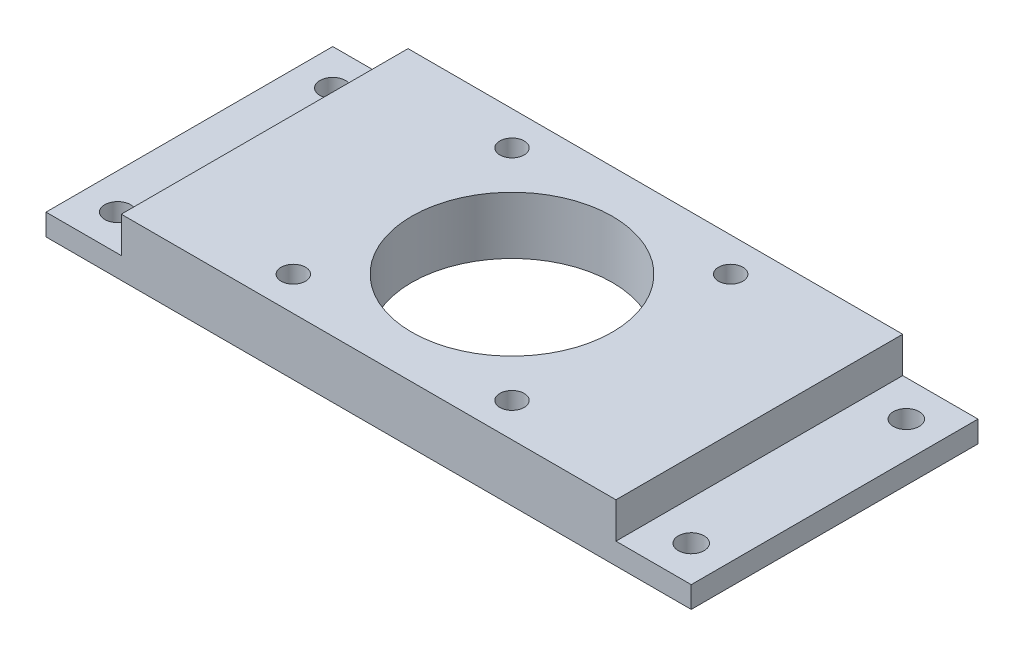
ISO-10303-21;
HEADER;
FILE_DESCRIPTION(('STEP AP214'),'2;1');
FILE_NAME('part.step','',(''),(''),'','','');
FILE_SCHEMA(('AUTOMOTIVE_DESIGN { 1 0 10303 214 1 1 1 1 }'));
ENDSEC;
DATA;
#1=APPLICATION_CONTEXT('core data for automotive mechanical design processes');
#2=APPLICATION_PROTOCOL_DEFINITION('international standard','automotive_design',2000,#1);
#3=PRODUCT_CONTEXT('',#1,'mechanical');
#4=PRODUCT('Part','Part','',(#3));
#5=PRODUCT_RELATED_PRODUCT_CATEGORY('part','',(#4));
#6=PRODUCT_DEFINITION_FORMATION('','',#4);
#7=PRODUCT_DEFINITION_CONTEXT('part definition',#1,'design');
#8=PRODUCT_DEFINITION('design','',#6,#7);
#9=PRODUCT_DEFINITION_SHAPE('','',#8);
#10=(LENGTH_UNIT() NAMED_UNIT(*) SI_UNIT(.MILLI.,.METRE.));
#11=(NAMED_UNIT(*) PLANE_ANGLE_UNIT() SI_UNIT($,.RADIAN.));
#12=(NAMED_UNIT(*) SI_UNIT($,.STERADIAN.) SOLID_ANGLE_UNIT());
#13=UNCERTAINTY_MEASURE_WITH_UNIT(LENGTH_MEASURE(1.E-05),#10,'distance_accuracy_value','');
#14=(GEOMETRIC_REPRESENTATION_CONTEXT(3) GLOBAL_UNCERTAINTY_ASSIGNED_CONTEXT((#13)) GLOBAL_UNIT_ASSIGNED_CONTEXT((#10,
#11,#12)) REPRESENTATION_CONTEXT('',''));
#15=CARTESIAN_POINT('',(0.,0.,0.));
#16=DIRECTION('',(0.,0.,1.));
#17=DIRECTION('',(1.,0.,0.));
#18=AXIS2_PLACEMENT_3D('',#15,#16,#17);
#19=CARTESIAN_POINT('',(0.,5.,0.));
#20=DIRECTION('',(0.,-1.,0.));
#21=DIRECTION('',(0.,0.,-1.));
#22=AXIS2_PLACEMENT_3D('',#19,#20,#21);
#23=PLANE('',#22);
#24=CARTESIAN_POINT('',(0.,5.,0.));
#25=DIRECTION('',(0.,1.,0.));
#26=DIRECTION('',(0.,0.,1.));
#27=AXIS2_PLACEMENT_3D('',#24,#25,#26);
#28=CIRCLE('',#27,14.);
#29=CARTESIAN_POINT('',(0.,5.,14.));
#30=VERTEX_POINT('',#29);
#31=EDGE_CURVE('E206',#30,#30,#28,.T.);
#32=ORIENTED_EDGE('',*,*,#31,.F.);
#33=EDGE_LOOP('',(#32));
#34=FACE_BOUND('',#33,.T.);
#35=CARTESIAN_POINT('',(15.25,5.,-15.25));
#36=DIRECTION('',(0.,1.,0.));
#37=DIRECTION('',(0.,0.,1.));
#38=AXIS2_PLACEMENT_3D('',#35,#36,#37);
#39=CIRCLE('',#38,1.7);
#40=CARTESIAN_POINT('',(15.25,5.,-13.55));
#41=VERTEX_POINT('',#40);
#42=EDGE_CURVE('E202',#41,#41,#39,.T.);
#43=ORIENTED_EDGE('',*,*,#42,.F.);
#44=EDGE_LOOP('',(#43));
#45=FACE_BOUND('',#44,.T.);
#46=CARTESIAN_POINT('',(-15.25,5.,15.25));
#47=DIRECTION('',(0.,1.,0.));
#48=DIRECTION('',(0.,0.,1.));
#49=AXIS2_PLACEMENT_3D('',#46,#47,#48);
#50=CIRCLE('',#49,1.7);
#51=CARTESIAN_POINT('',(-15.25,5.,16.95));
#52=VERTEX_POINT('',#51);
#53=EDGE_CURVE('E196',#52,#52,#50,.T.);
#54=ORIENTED_EDGE('',*,*,#53,.F.);
#55=EDGE_LOOP('',(#54));
#56=FACE_BOUND('',#55,.T.);
#57=CARTESIAN_POINT('',(-15.25,5.,-15.25));
#58=DIRECTION('',(0.,1.,0.));
#59=DIRECTION('',(0.,0.,1.));
#60=AXIS2_PLACEMENT_3D('',#57,#58,#59);
#61=CIRCLE('',#60,1.7);
#62=CARTESIAN_POINT('',(-15.25,5.,-13.55));
#63=VERTEX_POINT('',#62);
#64=EDGE_CURVE('E190',#63,#63,#61,.T.);
#65=ORIENTED_EDGE('',*,*,#64,.F.);
#66=EDGE_LOOP('',(#65));
#67=FACE_BOUND('',#66,.T.);
#68=CARTESIAN_POINT('',(15.25,5.,15.25));
#69=DIRECTION('',(0.,1.,0.));
#70=DIRECTION('',(0.,0.,1.));
#71=AXIS2_PLACEMENT_3D('',#68,#69,#70);
#72=CIRCLE('',#71,1.7);
#73=CARTESIAN_POINT('',(15.25,5.,16.95));
#74=VERTEX_POINT('',#73);
#75=EDGE_CURVE('E184',#74,#74,#72,.T.);
#76=ORIENTED_EDGE('',*,*,#75,.F.);
#77=EDGE_LOOP('',(#76));
#78=FACE_BOUND('',#77,.T.);
#79=DIRECTION('',(0.,0.,-1.));
#80=VECTOR('',#79,1.);
#81=CARTESIAN_POINT('',(34.5,5.,20.));
#82=LINE('',#81,#80);
#83=CARTESIAN_POINT('',(34.5,5.,20.));
#84=VERTEX_POINT('',#83);
#85=CARTESIAN_POINT('',(34.5,5.,-20.));
#86=VERTEX_POINT('',#85);
#87=EDGE_CURVE('E118',#84,#86,#82,.T.);
#88=ORIENTED_EDGE('',*,*,#87,.T.);
#89=DIRECTION('',(-1.,0.,0.));
#90=VECTOR('',#89,1.);
#91=CARTESIAN_POINT('',(-35.,5.,-20.));
#92=LINE('',#91,#90);
#93=CARTESIAN_POINT('',(-34.5,5.,-20.));
#94=VERTEX_POINT('',#93);
#95=EDGE_CURVE('E48',#86,#94,#92,.T.);
#96=ORIENTED_EDGE('',*,*,#95,.T.);
#97=DIRECTION('',(0.,0.,-1.));
#98=VECTOR('',#97,1.);
#99=CARTESIAN_POINT('',(-34.5,5.,20.));
#100=LINE('',#99,#98);
#101=CARTESIAN_POINT('',(-34.5,5.,20.));
#102=VERTEX_POINT('',#101);
#103=EDGE_CURVE('E209',#102,#94,#100,.T.);
#104=ORIENTED_EDGE('',*,*,#103,.F.);
#105=DIRECTION('',(1.,0.,0.));
#106=VECTOR('',#105,1.);
#107=CARTESIAN_POINT('',(-35.,5.,20.));
#108=LINE('',#107,#106);
#109=EDGE_CURVE('E11',#102,#84,#108,.T.);
#110=ORIENTED_EDGE('',*,*,#109,.T.);
#111=EDGE_LOOP('',(#88,#96,#104,#110));
#112=FACE_BOUND('',#111,.T.);
#113=ADVANCED_FACE('F39',(#34,#45,#56,#67,#78,#112),#23,.F.);
#114=CARTESIAN_POINT('',(-35.,5.,-20.));
#115=DIRECTION('',(0.,0.,1.));
#116=DIRECTION('',(1.,0.,0.));
#117=AXIS2_PLACEMENT_3D('',#114,#115,#116);
#118=PLANE('',#117);
#119=DIRECTION('',(0.,-1.,0.));
#120=VECTOR('',#119,1.);
#121=CARTESIAN_POINT('',(34.5,5.,-20.));
#122=LINE('',#121,#120);
#123=CARTESIAN_POINT('',(34.5,0.,-20.));
#124=VERTEX_POINT('',#123);
#125=EDGE_CURVE('E114',#86,#124,#122,.T.);
#126=ORIENTED_EDGE('',*,*,#125,.T.);
#127=DIRECTION('',(1.,0.,0.));
#128=VECTOR('',#127,1.);
#129=CARTESIAN_POINT('',(-45.,0.,-20.));
#130=LINE('',#129,#128);
#131=CARTESIAN_POINT('',(45.,0.,-20.));
#132=VERTEX_POINT('',#131);
#133=EDGE_CURVE('E81',#124,#132,#130,.T.);
#134=ORIENTED_EDGE('',*,*,#133,.T.);
#135=DIRECTION('',(0.,1.,0.));
#136=VECTOR('',#135,1.);
#137=CARTESIAN_POINT('',(45.,-3.,-20.));
#138=LINE('',#137,#136);
#139=CARTESIAN_POINT('',(45.,-3.,-20.));
#140=VERTEX_POINT('',#139);
#141=EDGE_CURVE('E140',#140,#132,#138,.T.);
#142=ORIENTED_EDGE('',*,*,#141,.F.);
#143=DIRECTION('',(1.,0.,0.));
#144=VECTOR('',#143,1.);
#145=CARTESIAN_POINT('',(-45.,-3.,-20.));
#146=LINE('',#145,#144);
#147=CARTESIAN_POINT('',(-45.,-3.,-20.));
#148=VERTEX_POINT('',#147);
#149=EDGE_CURVE('E56',#148,#140,#146,.T.);
#150=ORIENTED_EDGE('',*,*,#149,.F.);
#151=DIRECTION('',(0.,1.,0.));
#152=VECTOR('',#151,1.);
#153=CARTESIAN_POINT('',(-45.,-3.,-20.));
#154=LINE('',#153,#152);
#155=CARTESIAN_POINT('',(-45.,0.,-20.));
#156=VERTEX_POINT('',#155);
#157=EDGE_CURVE('E138',#148,#156,#154,.T.);
#158=ORIENTED_EDGE('',*,*,#157,.T.);
#159=CARTESIAN_POINT('',(-34.5,0.,-20.));
#160=VERTEX_POINT('',#159);
#161=EDGE_CURVE('E142',#156,#160,#130,.T.);
#162=ORIENTED_EDGE('',*,*,#161,.T.);
#163=DIRECTION('',(0.,-1.,0.));
#164=VECTOR('',#163,1.);
#165=CARTESIAN_POINT('',(-34.5,5.,-20.));
#166=LINE('',#165,#164);
#167=EDGE_CURVE('E132',#94,#160,#166,.T.);
#168=ORIENTED_EDGE('',*,*,#167,.F.);
#169=ORIENTED_EDGE('',*,*,#95,.F.);
#170=EDGE_LOOP('',(#126,#134,#142,#150,#158,#162,#168,#169));
#171=FACE_BOUND('',#170,.T.);
#172=ADVANCED_FACE('F41',(#171),#118,.F.);
#173=CARTESIAN_POINT('',(-35.,5.,20.));
#174=DIRECTION('',(0.,0.,-1.));
#175=DIRECTION('',(-1.,0.,0.));
#176=AXIS2_PLACEMENT_3D('',#173,#174,#175);
#177=PLANE('',#176);
#178=DIRECTION('',(-1.,0.,0.));
#179=VECTOR('',#178,1.);
#180=CARTESIAN_POINT('',(-45.,0.,20.));
#181=LINE('',#180,#179);
#182=CARTESIAN_POINT('',(45.,0.,20.));
#183=VERTEX_POINT('',#182);
#184=CARTESIAN_POINT('',(34.5,0.,20.));
#185=VERTEX_POINT('',#184);
#186=EDGE_CURVE('E146',#183,#185,#181,.T.);
#187=ORIENTED_EDGE('',*,*,#186,.T.);
#188=DIRECTION('',(0.,1.,0.));
#189=VECTOR('',#188,1.);
#190=CARTESIAN_POINT('',(34.5,0.,20.));
#191=LINE('',#190,#189);
#192=EDGE_CURVE('E128',#185,#84,#191,.T.);
#193=ORIENTED_EDGE('',*,*,#192,.T.);
#194=ORIENTED_EDGE('',*,*,#109,.F.);
#195=DIRECTION('',(0.,1.,0.));
#196=VECTOR('',#195,1.);
#197=CARTESIAN_POINT('',(-34.5,0.,20.));
#198=LINE('',#197,#196);
#199=CARTESIAN_POINT('',(-34.5,0.,20.));
#200=VERTEX_POINT('',#199);
#201=EDGE_CURVE('E213',#200,#102,#198,.T.);
#202=ORIENTED_EDGE('',*,*,#201,.F.);
#203=CARTESIAN_POINT('',(-45.,0.,20.));
#204=VERTEX_POINT('',#203);
#205=EDGE_CURVE('E148',#200,#204,#181,.T.);
#206=ORIENTED_EDGE('',*,*,#205,.T.);
#207=DIRECTION('',(0.,1.,0.));
#208=VECTOR('',#207,1.);
#209=CARTESIAN_POINT('',(-45.,-3.,20.));
#210=LINE('',#209,#208);
#211=CARTESIAN_POINT('',(-45.,-3.,20.));
#212=VERTEX_POINT('',#211);
#213=EDGE_CURVE('E134',#212,#204,#210,.T.);
#214=ORIENTED_EDGE('',*,*,#213,.F.);
#215=DIRECTION('',(-1.,0.,0.));
#216=VECTOR('',#215,1.);
#217=CARTESIAN_POINT('',(-45.,-3.,20.));
#218=LINE('',#217,#216);
#219=CARTESIAN_POINT('',(45.,-3.,20.));
#220=VERTEX_POINT('',#219);
#221=EDGE_CURVE('E89',#220,#212,#218,.T.);
#222=ORIENTED_EDGE('',*,*,#221,.F.);
#223=DIRECTION('',(0.,1.,0.));
#224=VECTOR('',#223,1.);
#225=CARTESIAN_POINT('',(45.,-3.,20.));
#226=LINE('',#225,#224);
#227=EDGE_CURVE('E133',#220,#183,#226,.T.);
#228=ORIENTED_EDGE('',*,*,#227,.T.);
#229=EDGE_LOOP('',(#187,#193,#194,#202,#206,#214,#222,#228));
#230=FACE_BOUND('',#229,.T.);
#231=ADVANCED_FACE('F220',(#230),#177,.F.);
#232=CARTESIAN_POINT('',(0.,0.,0.));
#233=DIRECTION('',(0.,1.,0.));
#234=DIRECTION('',(0.,0.,1.));
#235=AXIS2_PLACEMENT_3D('',#232,#233,#234);
#236=PLANE('',#235);
#237=CARTESIAN_POINT('',(40.,0.,-15.));
#238=DIRECTION('',(0.,1.,0.));
#239=DIRECTION('',(0.,0.,1.));
#240=AXIS2_PLACEMENT_3D('',#237,#238,#239);
#241=CIRCLE('',#240,1.8);
#242=CARTESIAN_POINT('',(40.,0.,-13.2));
#243=VERTEX_POINT('',#242);
#244=EDGE_CURVE('E166',#243,#243,#241,.T.);
#245=ORIENTED_EDGE('',*,*,#244,.F.);
#246=EDGE_LOOP('',(#245));
#247=FACE_BOUND('',#246,.T.);
#248=CARTESIAN_POINT('',(40.,0.,15.));
#249=DIRECTION('',(0.,1.,0.));
#250=DIRECTION('',(0.,0.,1.));
#251=AXIS2_PLACEMENT_3D('',#248,#249,#250);
#252=CIRCLE('',#251,1.8);
#253=CARTESIAN_POINT('',(40.,0.,16.8));
#254=VERTEX_POINT('',#253);
#255=EDGE_CURVE('E160',#254,#254,#252,.T.);
#256=ORIENTED_EDGE('',*,*,#255,.F.);
#257=EDGE_LOOP('',(#256));
#258=FACE_BOUND('',#257,.T.);
#259=ORIENTED_EDGE('',*,*,#133,.F.);
#260=DIRECTION('',(0.,0.,1.));
#261=VECTOR('',#260,1.);
#262=CARTESIAN_POINT('',(34.5,0.,-20.));
#263=LINE('',#262,#261);
#264=EDGE_CURVE('E121',#124,#185,#263,.T.);
#265=ORIENTED_EDGE('',*,*,#264,.T.);
#266=ORIENTED_EDGE('',*,*,#186,.F.);
#267=DIRECTION('',(0.,0.,1.));
#268=VECTOR('',#267,1.);
#269=CARTESIAN_POINT('',(45.,0.,-20.));
#270=LINE('',#269,#268);
#271=EDGE_CURVE('E149',#132,#183,#270,.T.);
#272=ORIENTED_EDGE('',*,*,#271,.F.);
#273=EDGE_LOOP('',(#259,#265,#266,#272));
#274=FACE_BOUND('',#273,.T.);
#275=ADVANCED_FACE('F225',(#247,#258,#274),#236,.T.);
#276=CARTESIAN_POINT('',(-40.,0.,-15.));
#277=DIRECTION('',(0.,1.,0.));
#278=DIRECTION('',(0.,0.,1.));
#279=AXIS2_PLACEMENT_3D('',#276,#277,#278);
#280=CIRCLE('',#279,1.8);
#281=CARTESIAN_POINT('',(-40.,0.,-13.2));
#282=VERTEX_POINT('',#281);
#283=EDGE_CURVE('E178',#282,#282,#280,.T.);
#284=ORIENTED_EDGE('',*,*,#283,.F.);
#285=EDGE_LOOP('',(#284));
#286=FACE_BOUND('',#285,.T.);
#287=CARTESIAN_POINT('',(-40.,0.,15.));
#288=DIRECTION('',(0.,1.,0.));
#289=DIRECTION('',(0.,0.,1.));
#290=AXIS2_PLACEMENT_3D('',#287,#288,#289);
#291=CIRCLE('',#290,1.8);
#292=CARTESIAN_POINT('',(-40.,0.,16.8));
#293=VERTEX_POINT('',#292);
#294=EDGE_CURVE('E172',#293,#293,#291,.T.);
#295=ORIENTED_EDGE('',*,*,#294,.F.);
#296=EDGE_LOOP('',(#295));
#297=FACE_BOUND('',#296,.T.);
#298=ORIENTED_EDGE('',*,*,#205,.F.);
#299=DIRECTION('',(0.,0.,1.));
#300=VECTOR('',#299,1.);
#301=CARTESIAN_POINT('',(-34.5,0.,-20.));
#302=LINE('',#301,#300);
#303=EDGE_CURVE('E215',#160,#200,#302,.T.);
#304=ORIENTED_EDGE('',*,*,#303,.F.);
#305=ORIENTED_EDGE('',*,*,#161,.F.);
#306=DIRECTION('',(0.,0.,-1.));
#307=VECTOR('',#306,1.);
#308=CARTESIAN_POINT('',(-45.,0.,-20.));
#309=LINE('',#308,#307);
#310=EDGE_CURVE('E74',#204,#156,#309,.T.);
#311=ORIENTED_EDGE('',*,*,#310,.F.);
#312=EDGE_LOOP('',(#298,#304,#305,#311));
#313=FACE_BOUND('',#312,.T.);
#314=ADVANCED_FACE('F233',(#286,#297,#313),#236,.T.);
#315=CARTESIAN_POINT('',(45.,-3.,-20.));
#316=DIRECTION('',(-1.,0.,0.));
#317=DIRECTION('',(0.,0.,1.));
#318=AXIS2_PLACEMENT_3D('',#315,#316,#317);
#319=PLANE('',#318);
#320=ORIENTED_EDGE('',*,*,#271,.T.);
#321=ORIENTED_EDGE('',*,*,#227,.F.);
#322=DIRECTION('',(0.,0.,1.));
#323=VECTOR('',#322,1.);
#324=CARTESIAN_POINT('',(45.,-3.,-20.));
#325=LINE('',#324,#323);
#326=EDGE_CURVE('E144',#140,#220,#325,.T.);
#327=ORIENTED_EDGE('',*,*,#326,.F.);
#328=ORIENTED_EDGE('',*,*,#141,.T.);
#329=EDGE_LOOP('',(#320,#321,#327,#328));
#330=FACE_BOUND('',#329,.T.);
#331=ADVANCED_FACE('F227',(#330),#319,.F.);
#332=CARTESIAN_POINT('',(-45.,-3.,-20.));
#333=DIRECTION('',(1.,0.,0.));
#334=DIRECTION('',(0.,0.,-1.));
#335=AXIS2_PLACEMENT_3D('',#332,#333,#334);
#336=PLANE('',#335);
#337=ORIENTED_EDGE('',*,*,#310,.T.);
#338=ORIENTED_EDGE('',*,*,#157,.F.);
#339=DIRECTION('',(0.,0.,-1.));
#340=VECTOR('',#339,1.);
#341=CARTESIAN_POINT('',(-45.,-3.,-20.));
#342=LINE('',#341,#340);
#343=EDGE_CURVE('E154',#212,#148,#342,.T.);
#344=ORIENTED_EDGE('',*,*,#343,.F.);
#345=ORIENTED_EDGE('',*,*,#213,.T.);
#346=EDGE_LOOP('',(#337,#338,#344,#345));
#347=FACE_BOUND('',#346,.T.);
#348=ADVANCED_FACE('F236',(#347),#336,.F.);
#349=CARTESIAN_POINT('',(0.,-3.,0.));
#350=DIRECTION('',(0.,1.,0.));
#351=DIRECTION('',(0.,0.,1.));
#352=AXIS2_PLACEMENT_3D('',#349,#350,#351);
#353=PLANE('',#352);
#354=CARTESIAN_POINT('',(0.,-3.,0.));
#355=DIRECTION('',(0.,1.,0.));
#356=DIRECTION('',(0.,0.,1.));
#357=AXIS2_PLACEMENT_3D('',#354,#355,#356);
#358=CIRCLE('',#357,14.);
#359=CARTESIAN_POINT('',(0.,-3.,14.));
#360=VERTEX_POINT('',#359);
#361=EDGE_CURVE('E205',#360,#360,#358,.T.);
#362=ORIENTED_EDGE('',*,*,#361,.T.);
#363=EDGE_LOOP('',(#362));
#364=FACE_BOUND('',#363,.T.);
#365=CARTESIAN_POINT('',(15.25,-3.,-15.25));
#366=DIRECTION('',(0.,1.,0.));
#367=DIRECTION('',(0.,0.,1.));
#368=AXIS2_PLACEMENT_3D('',#365,#366,#367);
#369=CIRCLE('',#368,1.7);
#370=CARTESIAN_POINT('',(15.25,-3.,-13.55));
#371=VERTEX_POINT('',#370);
#372=EDGE_CURVE('E199',#371,#371,#369,.T.);
#373=ORIENTED_EDGE('',*,*,#372,.T.);
#374=EDGE_LOOP('',(#373));
#375=FACE_BOUND('',#374,.T.);
#376=CARTESIAN_POINT('',(-15.25,-3.,15.25));
#377=DIRECTION('',(0.,1.,0.));
#378=DIRECTION('',(0.,0.,1.));
#379=AXIS2_PLACEMENT_3D('',#376,#377,#378);
#380=CIRCLE('',#379,1.7);
#381=CARTESIAN_POINT('',(-15.25,-3.,16.95));
#382=VERTEX_POINT('',#381);
#383=EDGE_CURVE('E193',#382,#382,#380,.T.);
#384=ORIENTED_EDGE('',*,*,#383,.T.);
#385=EDGE_LOOP('',(#384));
#386=FACE_BOUND('',#385,.T.);
#387=CARTESIAN_POINT('',(-15.25,-3.,-15.25));
#388=DIRECTION('',(0.,1.,0.));
#389=DIRECTION('',(0.,0.,1.));
#390=AXIS2_PLACEMENT_3D('',#387,#388,#389);
#391=CIRCLE('',#390,1.7);
#392=CARTESIAN_POINT('',(-15.25,-3.,-13.55));
#393=VERTEX_POINT('',#392);
#394=EDGE_CURVE('E187',#393,#393,#391,.T.);
#395=ORIENTED_EDGE('',*,*,#394,.T.);
#396=EDGE_LOOP('',(#395));
#397=FACE_BOUND('',#396,.T.);
#398=CARTESIAN_POINT('',(15.25,-3.,15.25));
#399=DIRECTION('',(0.,1.,0.));
#400=DIRECTION('',(0.,0.,1.));
#401=AXIS2_PLACEMENT_3D('',#398,#399,#400);
#402=CIRCLE('',#401,1.7);
#403=CARTESIAN_POINT('',(15.25,-3.,16.95));
#404=VERTEX_POINT('',#403);
#405=EDGE_CURVE('E181',#404,#404,#402,.T.);
#406=ORIENTED_EDGE('',*,*,#405,.T.);
#407=EDGE_LOOP('',(#406));
#408=FACE_BOUND('',#407,.T.);
#409=CARTESIAN_POINT('',(-40.,-3.,-15.));
#410=DIRECTION('',(0.,1.,0.));
#411=DIRECTION('',(0.,0.,1.));
#412=AXIS2_PLACEMENT_3D('',#409,#410,#411);
#413=CIRCLE('',#412,1.8);
#414=CARTESIAN_POINT('',(-40.,-3.,-13.2));
#415=VERTEX_POINT('',#414);
#416=EDGE_CURVE('E175',#415,#415,#413,.T.);
#417=ORIENTED_EDGE('',*,*,#416,.T.);
#418=EDGE_LOOP('',(#417));
#419=FACE_BOUND('',#418,.T.);
#420=CARTESIAN_POINT('',(-40.,-3.,15.));
#421=DIRECTION('',(0.,1.,0.));
#422=DIRECTION('',(0.,0.,1.));
#423=AXIS2_PLACEMENT_3D('',#420,#421,#422);
#424=CIRCLE('',#423,1.8);
#425=CARTESIAN_POINT('',(-40.,-3.,16.8));
#426=VERTEX_POINT('',#425);
#427=EDGE_CURVE('E169',#426,#426,#424,.T.);
#428=ORIENTED_EDGE('',*,*,#427,.T.);
#429=EDGE_LOOP('',(#428));
#430=FACE_BOUND('',#429,.T.);
#431=CARTESIAN_POINT('',(40.,-3.,-15.));
#432=DIRECTION('',(0.,1.,0.));
#433=DIRECTION('',(0.,0.,1.));
#434=AXIS2_PLACEMENT_3D('',#431,#432,#433);
#435=CIRCLE('',#434,1.8);
#436=CARTESIAN_POINT('',(40.,-3.,-13.2));
#437=VERTEX_POINT('',#436);
#438=EDGE_CURVE('E163',#437,#437,#435,.T.);
#439=ORIENTED_EDGE('',*,*,#438,.T.);
#440=EDGE_LOOP('',(#439));
#441=FACE_BOUND('',#440,.T.);
#442=CARTESIAN_POINT('',(40.,-3.,15.));
#443=DIRECTION('',(0.,1.,0.));
#444=DIRECTION('',(0.,0.,1.));
#445=AXIS2_PLACEMENT_3D('',#442,#443,#444);
#446=CIRCLE('',#445,1.8);
#447=CARTESIAN_POINT('',(40.,-3.,16.8));
#448=VERTEX_POINT('',#447);
#449=EDGE_CURVE('E152',#448,#448,#446,.T.);
#450=ORIENTED_EDGE('',*,*,#449,.T.);
#451=EDGE_LOOP('',(#450));
#452=FACE_BOUND('',#451,.T.);
#453=ORIENTED_EDGE('',*,*,#326,.T.);
#454=ORIENTED_EDGE('',*,*,#221,.T.);
#455=ORIENTED_EDGE('',*,*,#343,.T.);
#456=ORIENTED_EDGE('',*,*,#149,.T.);
#457=EDGE_LOOP('',(#453,#454,#455,#456));
#458=FACE_BOUND('',#457,.T.);
#459=ADVANCED_FACE('F237',(#364,#375,#386,#397,#408,#419,#430,#441,#452,#458),#353,.F.);
#460=CARTESIAN_POINT('',(40.,0.,15.));
#461=DIRECTION('',(0.,1.,0.));
#462=DIRECTION('',(0.,0.,1.));
#463=AXIS2_PLACEMENT_3D('',#460,#461,#462);
#464=CYLINDRICAL_SURFACE('',#463,1.8);
#465=ORIENTED_EDGE('',*,*,#449,.F.);
#466=EDGE_LOOP('',(#465));
#467=FACE_BOUND('',#466,.T.);
#468=ORIENTED_EDGE('',*,*,#255,.T.);
#469=EDGE_LOOP('',(#468));
#470=FACE_BOUND('',#469,.T.);
#471=ADVANCED_FACE('F239',(#467,#470),#464,.F.);
#472=CARTESIAN_POINT('',(40.,0.,-15.));
#473=DIRECTION('',(0.,1.,0.));
#474=DIRECTION('',(0.,0.,1.));
#475=AXIS2_PLACEMENT_3D('',#472,#473,#474);
#476=CYLINDRICAL_SURFACE('',#475,1.8);
#477=ORIENTED_EDGE('',*,*,#438,.F.);
#478=EDGE_LOOP('',(#477));
#479=FACE_BOUND('',#478,.T.);
#480=ORIENTED_EDGE('',*,*,#244,.T.);
#481=EDGE_LOOP('',(#480));
#482=FACE_BOUND('',#481,.T.);
#483=ADVANCED_FACE('F246',(#479,#482),#476,.F.);
#484=CARTESIAN_POINT('',(-40.,0.,15.));
#485=DIRECTION('',(0.,1.,0.));
#486=DIRECTION('',(0.,0.,1.));
#487=AXIS2_PLACEMENT_3D('',#484,#485,#486);
#488=CYLINDRICAL_SURFACE('',#487,1.8);
#489=ORIENTED_EDGE('',*,*,#427,.F.);
#490=EDGE_LOOP('',(#489));
#491=FACE_BOUND('',#490,.T.);
#492=ORIENTED_EDGE('',*,*,#294,.T.);
#493=EDGE_LOOP('',(#492));
#494=FACE_BOUND('',#493,.T.);
#495=ADVANCED_FACE('F276',(#491,#494),#488,.F.);
#496=CARTESIAN_POINT('',(-40.,0.,-15.));
#497=DIRECTION('',(0.,1.,0.));
#498=DIRECTION('',(0.,0.,1.));
#499=AXIS2_PLACEMENT_3D('',#496,#497,#498);
#500=CYLINDRICAL_SURFACE('',#499,1.8);
#501=ORIENTED_EDGE('',*,*,#416,.F.);
#502=EDGE_LOOP('',(#501));
#503=FACE_BOUND('',#502,.T.);
#504=ORIENTED_EDGE('',*,*,#283,.T.);
#505=EDGE_LOOP('',(#504));
#506=FACE_BOUND('',#505,.T.);
#507=ADVANCED_FACE('F282',(#503,#506),#500,.F.);
#508=CARTESIAN_POINT('',(15.25,5.,15.25));
#509=DIRECTION('',(0.,1.,0.));
#510=DIRECTION('',(0.,0.,1.));
#511=AXIS2_PLACEMENT_3D('',#508,#509,#510);
#512=CYLINDRICAL_SURFACE('',#511,1.7);
#513=ORIENTED_EDGE('',*,*,#405,.F.);
#514=EDGE_LOOP('',(#513));
#515=FACE_BOUND('',#514,.T.);
#516=ORIENTED_EDGE('',*,*,#75,.T.);
#517=EDGE_LOOP('',(#516));
#518=FACE_BOUND('',#517,.T.);
#519=ADVANCED_FACE('F289',(#515,#518),#512,.F.);
#520=CARTESIAN_POINT('',(-15.25,5.,-15.25));
#521=DIRECTION('',(0.,1.,0.));
#522=DIRECTION('',(0.,0.,1.));
#523=AXIS2_PLACEMENT_3D('',#520,#521,#522);
#524=CYLINDRICAL_SURFACE('',#523,1.7);
#525=ORIENTED_EDGE('',*,*,#394,.F.);
#526=EDGE_LOOP('',(#525));
#527=FACE_BOUND('',#526,.T.);
#528=ORIENTED_EDGE('',*,*,#64,.T.);
#529=EDGE_LOOP('',(#528));
#530=FACE_BOUND('',#529,.T.);
#531=ADVANCED_FACE('F293',(#527,#530),#524,.F.);
#532=CARTESIAN_POINT('',(-15.25,5.,15.25));
#533=DIRECTION('',(0.,1.,0.));
#534=DIRECTION('',(0.,0.,1.));
#535=AXIS2_PLACEMENT_3D('',#532,#533,#534);
#536=CYLINDRICAL_SURFACE('',#535,1.7);
#537=ORIENTED_EDGE('',*,*,#383,.F.);
#538=EDGE_LOOP('',(#537));
#539=FACE_BOUND('',#538,.T.);
#540=ORIENTED_EDGE('',*,*,#53,.T.);
#541=EDGE_LOOP('',(#540));
#542=FACE_BOUND('',#541,.T.);
#543=ADVANCED_FACE('F297',(#539,#542),#536,.F.);
#544=CARTESIAN_POINT('',(15.25,5.,-15.25));
#545=DIRECTION('',(0.,1.,0.));
#546=DIRECTION('',(0.,0.,1.));
#547=AXIS2_PLACEMENT_3D('',#544,#545,#546);
#548=CYLINDRICAL_SURFACE('',#547,1.7);
#549=ORIENTED_EDGE('',*,*,#372,.F.);
#550=EDGE_LOOP('',(#549));
#551=FACE_BOUND('',#550,.T.);
#552=ORIENTED_EDGE('',*,*,#42,.T.);
#553=EDGE_LOOP('',(#552));
#554=FACE_BOUND('',#553,.T.);
#555=ADVANCED_FACE('F301',(#551,#554),#548,.F.);
#556=CARTESIAN_POINT('',(0.,-3.,0.));
#557=DIRECTION('',(0.,1.,0.));
#558=DIRECTION('',(0.,0.,1.));
#559=AXIS2_PLACEMENT_3D('',#556,#557,#558);
#560=CYLINDRICAL_SURFACE('',#559,14.);
#561=ORIENTED_EDGE('',*,*,#361,.F.);
#562=EDGE_LOOP('',(#561));
#563=FACE_BOUND('',#562,.T.);
#564=ORIENTED_EDGE('',*,*,#31,.T.);
#565=EDGE_LOOP('',(#564));
#566=FACE_BOUND('',#565,.T.);
#567=ADVANCED_FACE('F305',(#563,#566),#560,.F.);
#568=CARTESIAN_POINT('',(-34.5,0.,0.));
#569=DIRECTION('',(-1.,0.,0.));
#570=DIRECTION('',(0.,0.,1.));
#571=AXIS2_PLACEMENT_3D('',#568,#569,#570);
#572=PLANE('',#571);
#573=ORIENTED_EDGE('',*,*,#167,.T.);
#574=ORIENTED_EDGE('',*,*,#303,.T.);
#575=ORIENTED_EDGE('',*,*,#201,.T.);
#576=ORIENTED_EDGE('',*,*,#103,.T.);
#577=EDGE_LOOP('',(#573,#574,#575,#576));
#578=FACE_BOUND('',#577,.T.);
#579=ADVANCED_FACE('F235',(#578),#572,.T.);
#580=CARTESIAN_POINT('',(34.5,0.,0.));
#581=DIRECTION('',(1.,0.,0.));
#582=DIRECTION('',(0.,0.,1.));
#583=AXIS2_PLACEMENT_3D('',#580,#581,#582);
#584=PLANE('',#583);
#585=ORIENTED_EDGE('',*,*,#125,.F.);
#586=ORIENTED_EDGE('',*,*,#87,.F.);
#587=ORIENTED_EDGE('',*,*,#192,.F.);
#588=ORIENTED_EDGE('',*,*,#264,.F.);
#589=EDGE_LOOP('',(#585,#586,#587,#588));
#590=FACE_BOUND('',#589,.T.);
#591=ADVANCED_FACE('F116',(#590),#584,.T.);
#592=CLOSED_SHELL('',(#113,#172,#231,#275,#314,#331,#348,#459,#471,#483,#495,#507,#519,#531,
#543,#555,#567,#579,#591));
#593=MANIFOLD_SOLID_BREP('B2',#592);
#594=ADVANCED_BREP_SHAPE_REPRESENTATION('',(#18,#593),#14);
#595=SHAPE_DEFINITION_REPRESENTATION(#9,#594);
ENDSEC;
END-ISO-10303-21;
